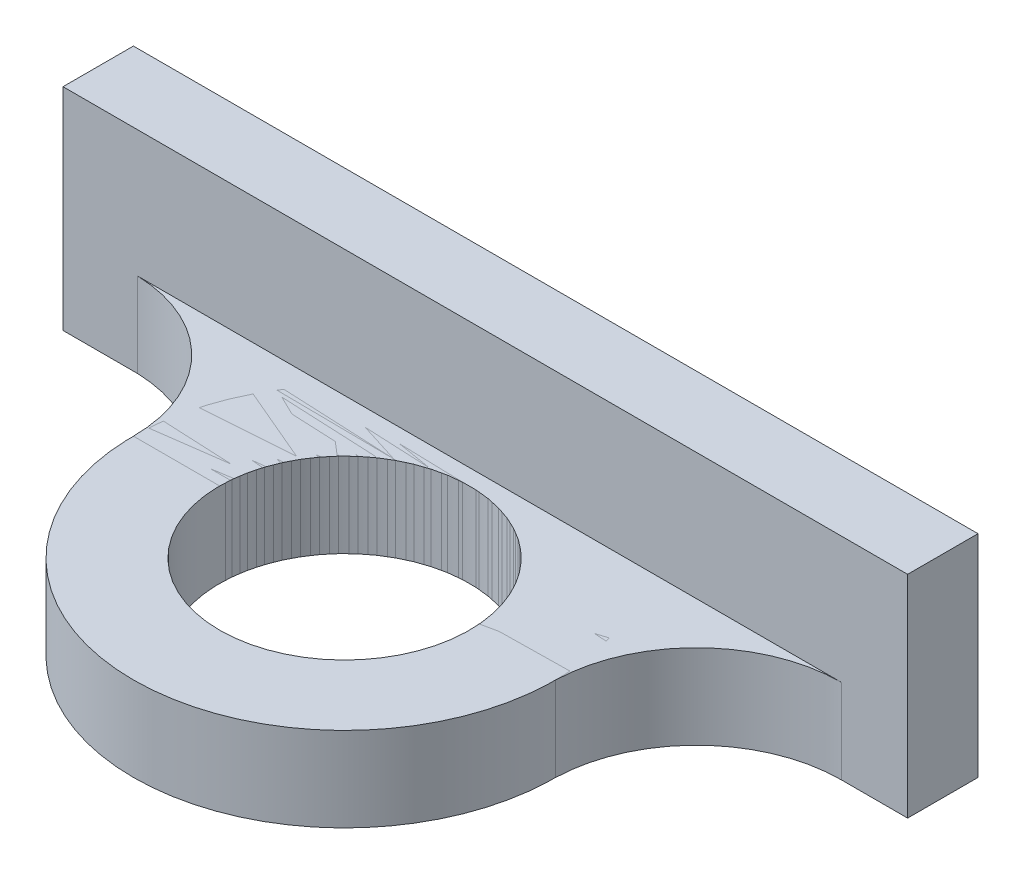
ISO-10303-21;
HEADER;
FILE_DESCRIPTION(('STEP AP214'),'2;1');
FILE_NAME('part.step','',(''),(''),'','','');
FILE_SCHEMA(('AUTOMOTIVE_DESIGN { 1 0 10303 214 1 1 1 1 }'));
ENDSEC;
DATA;
#1=APPLICATION_CONTEXT('core data for automotive mechanical design processes');
#2=APPLICATION_PROTOCOL_DEFINITION('international standard','automotive_design',2000,#1);
#3=PRODUCT_CONTEXT('',#1,'mechanical');
#4=PRODUCT('Part','Part','',(#3));
#5=PRODUCT_RELATED_PRODUCT_CATEGORY('part','',(#4));
#6=PRODUCT_DEFINITION_FORMATION('','',#4);
#7=PRODUCT_DEFINITION_CONTEXT('part definition',#1,'design');
#8=PRODUCT_DEFINITION('design','',#6,#7);
#9=PRODUCT_DEFINITION_SHAPE('','',#8);
#10=(LENGTH_UNIT() NAMED_UNIT(*) SI_UNIT(.MILLI.,.METRE.));
#11=(NAMED_UNIT(*) PLANE_ANGLE_UNIT() SI_UNIT($,.RADIAN.));
#12=(NAMED_UNIT(*) SI_UNIT($,.STERADIAN.) SOLID_ANGLE_UNIT());
#13=UNCERTAINTY_MEASURE_WITH_UNIT(LENGTH_MEASURE(1.E-05),#10,'distance_accuracy_value','');
#14=(GEOMETRIC_REPRESENTATION_CONTEXT(3) GLOBAL_UNCERTAINTY_ASSIGNED_CONTEXT((#13)) GLOBAL_UNIT_ASSIGNED_CONTEXT((#10,
#11,#12)) REPRESENTATION_CONTEXT('',''));
#15=CARTESIAN_POINT('',(0.,0.,0.));
#16=DIRECTION('',(0.,0.,1.));
#17=DIRECTION('',(1.,0.,0.));
#18=AXIS2_PLACEMENT_3D('',#15,#16,#17);
#19=CARTESIAN_POINT('',(0.,12.,-20.));
#20=DIRECTION('',(0.,0.,-1.));
#21=DIRECTION('',(-1.,0.,0.));
#22=AXIS2_PLACEMENT_3D('',#19,#20,#21);
#23=PLANE('',#22);
#24=DIRECTION('',(1.,0.,0.));
#25=VECTOR('',#24,1.);
#26=CARTESIAN_POINT('',(0.,0.,-20.));
#27=LINE('',#26,#25);
#28=CARTESIAN_POINT('',(-49.4267459225819,0.,-20.));
#29=VERTEX_POINT('',#28);
#30=CARTESIAN_POINT('',(50.5901699437495,0.,-20.));
#31=VERTEX_POINT('',#30);
#32=EDGE_CURVE('E132',#29,#31,#27,.T.);
#33=ORIENTED_EDGE('',*,*,#32,.F.);
#34=DIRECTION('',(0.,-1.,0.));
#35=VECTOR('',#34,1.);
#36=CARTESIAN_POINT('',(-49.4267459225819,12.,-20.));
#37=LINE('',#36,#35);
#38=CARTESIAN_POINT('',(-49.4267459225819,12.,-20.));
#39=VERTEX_POINT('',#38);
#40=EDGE_CURVE('E12',#39,#29,#37,.T.);
#41=ORIENTED_EDGE('',*,*,#40,.F.);
#42=DIRECTION('',(1.,0.,0.));
#43=VECTOR('',#42,1.);
#44=CARTESIAN_POINT('',(0.,12.,-20.));
#45=LINE('',#44,#43);
#46=CARTESIAN_POINT('',(50.5901699437495,12.,-20.));
#47=VERTEX_POINT('',#46);
#48=EDGE_CURVE('E146',#39,#47,#45,.T.);
#49=ORIENTED_EDGE('',*,*,#48,.T.);
#50=DIRECTION('',(0.,-1.,0.));
#51=VECTOR('',#50,1.);
#52=CARTESIAN_POINT('',(50.5901699437495,12.,-20.));
#53=LINE('',#52,#51);
#54=EDGE_CURVE('E50',#47,#31,#53,.T.);
#55=ORIENTED_EDGE('',*,*,#54,.T.);
#56=EDGE_LOOP('',(#33,#41,#49,#55));
#57=FACE_BOUND('',#56,.T.);
#58=ADVANCED_FACE('F47',(#57),#23,.T.);
#59=CARTESIAN_POINT('',(-50.0084579331656,12.,0.));
#60=DIRECTION('',(0.,-1.,0.));
#61=DIRECTION('',(0.,0.,-1.));
#62=AXIS2_PLACEMENT_3D('',#59,#60,#61);
#63=CYLINDRICAL_SURFACE('',#62,20.0084579331656);
#64=CARTESIAN_POINT('',(-50.0084579331656,0.,0.));
#65=DIRECTION('',(0.,-1.,0.));
#66=DIRECTION('',(0.,0.,-1.));
#67=AXIS2_PLACEMENT_3D('',#64,#65,#66);
#68=CIRCLE('',#67,20.0084579331656);
#69=CARTESIAN_POINT('',(-30.,0.,0.));
#70=VERTEX_POINT('',#69);
#71=EDGE_CURVE('E144',#70,#29,#68,.F.);
#72=ORIENTED_EDGE('',*,*,#71,.F.);
#73=DIRECTION('',(0.,-1.,0.));
#74=VECTOR('',#73,1.);
#75=CARTESIAN_POINT('',(-30.,12.,0.));
#76=LINE('',#75,#74);
#77=CARTESIAN_POINT('',(-30.,12.,0.));
#78=VERTEX_POINT('',#77);
#79=EDGE_CURVE('E56',#78,#70,#76,.T.);
#80=ORIENTED_EDGE('',*,*,#79,.F.);
#81=CARTESIAN_POINT('',(-50.0084579331656,12.,0.));
#82=DIRECTION('',(0.,-1.,0.));
#83=DIRECTION('',(0.,0.,-1.));
#84=AXIS2_PLACEMENT_3D('',#81,#82,#83);
#85=CIRCLE('',#84,20.0084579331656);
#86=EDGE_CURVE('E114',#78,#39,#85,.F.);
#87=ORIENTED_EDGE('',*,*,#86,.T.);
#88=ORIENTED_EDGE('',*,*,#40,.T.);
#89=EDGE_LOOP('',(#72,#80,#87,#88));
#90=FACE_BOUND('',#89,.T.);
#91=ADVANCED_FACE('F154',(#90),#63,.F.);
#92=CARTESIAN_POINT('',(0.,12.,0.));
#93=DIRECTION('',(0.,0.,-1.));
#94=DIRECTION('',(-1.,0.,0.));
#95=AXIS2_PLACEMENT_3D('',#92,#93,#94);
#96=PLANE('',#95);
#97=DIRECTION('',(1.,0.,0.));
#98=VECTOR('',#97,1.);
#99=CARTESIAN_POINT('',(0.,0.,0.));
#100=LINE('',#99,#98);
#101=CARTESIAN_POINT('',(-17.75,0.,0.));
#102=VERTEX_POINT('',#101);
#103=EDGE_CURVE('E118',#70,#102,#100,.T.);
#104=ORIENTED_EDGE('',*,*,#103,.T.);
#105=DIRECTION('',(0.,-1.,0.));
#106=VECTOR('',#105,1.);
#107=CARTESIAN_POINT('',(-17.75,12.,0.));
#108=LINE('',#107,#106);
#109=CARTESIAN_POINT('',(-17.75,12.,0.));
#110=VERTEX_POINT('',#109);
#111=EDGE_CURVE('E116',#110,#102,#108,.T.);
#112=ORIENTED_EDGE('',*,*,#111,.F.);
#113=DIRECTION('',(1.,0.,0.));
#114=VECTOR('',#113,1.);
#115=CARTESIAN_POINT('',(0.,12.,0.));
#116=LINE('',#115,#114);
#117=EDGE_CURVE('E107',#78,#110,#116,.T.);
#118=ORIENTED_EDGE('',*,*,#117,.F.);
#119=ORIENTED_EDGE('',*,*,#79,.T.);
#120=EDGE_LOOP('',(#104,#112,#118,#119));
#121=FACE_BOUND('',#120,.T.);
#122=ADVANCED_FACE('F117',(#121),#96,.F.);
#123=CARTESIAN_POINT('',(0.,12.,0.));
#124=DIRECTION('',(0.,-1.,0.));
#125=DIRECTION('',(0.,0.,-1.));
#126=AXIS2_PLACEMENT_3D('',#123,#124,#125);
#127=CYLINDRICAL_SURFACE('',#126,17.75);
#128=CARTESIAN_POINT('',(0.,0.,0.));
#129=DIRECTION('',(0.,-1.,0.));
#130=DIRECTION('',(0.,0.,-1.));
#131=AXIS2_PLACEMENT_3D('',#128,#129,#130);
#132=CIRCLE('',#131,17.75);
#133=CARTESIAN_POINT('',(17.75,0.,0.));
#134=VERTEX_POINT('',#133);
#135=EDGE_CURVE('E141',#134,#102,#132,.F.);
#136=ORIENTED_EDGE('',*,*,#135,.F.);
#137=DIRECTION('',(0.,-1.,0.));
#138=VECTOR('',#137,1.);
#139=CARTESIAN_POINT('',(17.75,12.,0.));
#140=LINE('',#139,#138);
#141=CARTESIAN_POINT('',(17.75,12.,0.));
#142=VERTEX_POINT('',#141);
#143=EDGE_CURVE('E122',#142,#134,#140,.T.);
#144=ORIENTED_EDGE('',*,*,#143,.F.);
#145=CARTESIAN_POINT('',(0.,12.,0.));
#146=DIRECTION('',(0.,-1.,0.));
#147=DIRECTION('',(0.,0.,-1.));
#148=AXIS2_PLACEMENT_3D('',#145,#146,#147);
#149=CIRCLE('',#148,17.75);
#150=EDGE_CURVE('E112',#142,#110,#149,.F.);
#151=ORIENTED_EDGE('',*,*,#150,.T.);
#152=ORIENTED_EDGE('',*,*,#111,.T.);
#153=EDGE_LOOP('',(#136,#144,#151,#152));
#154=FACE_BOUND('',#153,.T.);
#155=ADVANCED_FACE('F124',(#154),#127,.F.);
#156=CARTESIAN_POINT('',(0.,12.,0.));
#157=DIRECTION('',(0.,0.,1.));
#158=DIRECTION('',(1.,0.,0.));
#159=AXIS2_PLACEMENT_3D('',#156,#157,#158);
#160=PLANE('',#159);
#161=DIRECTION('',(-1.,0.,0.));
#162=VECTOR('',#161,1.);
#163=CARTESIAN_POINT('',(0.,0.,0.));
#164=LINE('',#163,#162);
#165=CARTESIAN_POINT('',(30.,0.,0.));
#166=VERTEX_POINT('',#165);
#167=EDGE_CURVE('E138',#166,#134,#164,.T.);
#168=ORIENTED_EDGE('',*,*,#167,.F.);
#169=DIRECTION('',(0.,-1.,0.));
#170=VECTOR('',#169,1.);
#171=CARTESIAN_POINT('',(30.,12.,0.));
#172=LINE('',#171,#170);
#173=CARTESIAN_POINT('',(30.,12.,0.));
#174=VERTEX_POINT('',#173);
#175=EDGE_CURVE('E149',#174,#166,#172,.T.);
#176=ORIENTED_EDGE('',*,*,#175,.F.);
#177=DIRECTION('',(-1.,0.,0.));
#178=VECTOR('',#177,1.);
#179=CARTESIAN_POINT('',(0.,12.,0.));
#180=LINE('',#179,#178);
#181=EDGE_CURVE('E125',#174,#142,#180,.T.);
#182=ORIENTED_EDGE('',*,*,#181,.T.);
#183=ORIENTED_EDGE('',*,*,#143,.T.);
#184=EDGE_LOOP('',(#168,#176,#182,#183));
#185=FACE_BOUND('',#184,.T.);
#186=ADVANCED_FACE('F167',(#185),#160,.T.);
#187=CARTESIAN_POINT('',(50.5901699437495,12.,0.598877457812107));
#188=DIRECTION('',(0.,-1.,0.));
#189=DIRECTION('',(0.,0.,-1.));
#190=AXIS2_PLACEMENT_3D('',#187,#188,#189);
#191=CYLINDRICAL_SURFACE('',#190,20.5988774578121);
#192=CARTESIAN_POINT('',(50.5901699437495,0.,0.598877457812107));
#193=DIRECTION('',(0.,-1.,0.));
#194=DIRECTION('',(0.,0.,-1.));
#195=AXIS2_PLACEMENT_3D('',#192,#193,#194);
#196=CIRCLE('',#195,20.5988774578121);
#197=EDGE_CURVE('E135',#31,#166,#196,.F.);
#198=ORIENTED_EDGE('',*,*,#197,.F.);
#199=ORIENTED_EDGE('',*,*,#54,.F.);
#200=CARTESIAN_POINT('',(50.5901699437495,12.,0.598877457812107));
#201=DIRECTION('',(0.,-1.,0.));
#202=DIRECTION('',(0.,0.,-1.));
#203=AXIS2_PLACEMENT_3D('',#200,#201,#202);
#204=CIRCLE('',#203,20.5988774578121);
#205=EDGE_CURVE('E127',#47,#174,#204,.F.);
#206=ORIENTED_EDGE('',*,*,#205,.T.);
#207=ORIENTED_EDGE('',*,*,#175,.T.);
#208=EDGE_LOOP('',(#198,#199,#206,#207));
#209=FACE_BOUND('',#208,.T.);
#210=ADVANCED_FACE('F151',(#209),#191,.F.);
#211=CARTESIAN_POINT('',(0.,12.,0.));
#212=DIRECTION('',(0.,-1.,0.));
#213=DIRECTION('',(0.,0.,-1.));
#214=AXIS2_PLACEMENT_3D('',#211,#212,#213);
#215=PLANE('',#214);
#216=ORIENTED_EDGE('',*,*,#48,.F.);
#217=ORIENTED_EDGE('',*,*,#86,.F.);
#218=ORIENTED_EDGE('',*,*,#117,.T.);
#219=ORIENTED_EDGE('',*,*,#150,.F.);
#220=ORIENTED_EDGE('',*,*,#181,.F.);
#221=ORIENTED_EDGE('',*,*,#205,.F.);
#222=EDGE_LOOP('',(#216,#217,#218,#219,#220,#221));
#223=FACE_BOUND('',#222,.T.);
#224=ADVANCED_FACE('F109',(#223),#215,.F.);
#225=CARTESIAN_POINT('',(0.,0.,0.));
#226=DIRECTION('',(0.,-1.,0.));
#227=DIRECTION('',(0.,0.,-1.));
#228=AXIS2_PLACEMENT_3D('',#225,#226,#227);
#229=PLANE('',#228);
#230=ORIENTED_EDGE('',*,*,#32,.T.);
#231=ORIENTED_EDGE('',*,*,#197,.T.);
#232=ORIENTED_EDGE('',*,*,#167,.T.);
#233=ORIENTED_EDGE('',*,*,#135,.T.);
#234=ORIENTED_EDGE('',*,*,#103,.F.);
#235=ORIENTED_EDGE('',*,*,#71,.T.);
#236=EDGE_LOOP('',(#230,#231,#232,#233,#234,#235));
#237=FACE_BOUND('',#236,.T.);
#238=ADVANCED_FACE('F153',(#237),#229,.T.);
#239=CLOSED_SHELL('',(#58,#91,#122,#155,#186,#210,#224,#238));
#240=MANIFOLD_SOLID_BREP('B2',#239);
#241=CARTESIAN_POINT('',(0.,12.,0.));
#242=DIRECTION('',(0.,1.,0.));
#243=DIRECTION('',(0.,0.,1.));
#244=AXIS2_PLACEMENT_3D('',#241,#242,#243);
#245=PLANE('',#244);
#246=DIRECTION('',(1.,0.,0.));
#247=VECTOR('',#246,1.);
#248=CARTESIAN_POINT('',(0.,12.,-20.));
#249=LINE('',#248,#247);
#250=CARTESIAN_POINT('',(-22.3606797749979,12.,-20.));
#251=VERTEX_POINT('',#250);
#252=CARTESIAN_POINT('',(22.3606797749979,12.,-20.));
#253=VERTEX_POINT('',#252);
#254=EDGE_CURVE('E265',#251,#253,#249,.T.);
#255=ORIENTED_EDGE('',*,*,#254,.F.);
#256=CARTESIAN_POINT('',(0.,12.,0.));
#257=DIRECTION('',(0.,1.,0.));
#258=DIRECTION('',(0.,0.,1.));
#259=AXIS2_PLACEMENT_3D('',#256,#257,#258);
#260=CIRCLE('',#259,30.);
#261=EDGE_CURVE('E348',#251,#253,#260,.T.);
#262=ORIENTED_EDGE('',*,*,#261,.T.);
#263=EDGE_LOOP('',(#255,#262));
#264=FACE_BOUND('',#263,.T.);
#265=CARTESIAN_POINT('',(0.,12.,0.));
#266=DIRECTION('',(0.,1.,0.));
#267=DIRECTION('',(0.,0.,1.));
#268=AXIS2_PLACEMENT_3D('',#265,#266,#267);
#269=CIRCLE('',#268,17.75);
#270=CARTESIAN_POINT('',(0.,12.,17.75));
#271=VERTEX_POINT('',#270);
#272=EDGE_CURVE('E343',#271,#271,#269,.T.);
#273=ORIENTED_EDGE('',*,*,#272,.F.);
#274=EDGE_LOOP('',(#273));
#275=FACE_BOUND('',#274,.T.);
#276=ADVANCED_FACE('F244',(#264,#275),#245,.T.);
#277=CARTESIAN_POINT('',(0.,0.,0.));
#278=DIRECTION('',(0.,1.,0.));
#279=DIRECTION('',(0.,0.,1.));
#280=AXIS2_PLACEMENT_3D('',#277,#278,#279);
#281=PLANE('',#280);
#282=CARTESIAN_POINT('',(0.,0.,0.));
#283=DIRECTION('',(0.,1.,0.));
#284=DIRECTION('',(0.,0.,1.));
#285=AXIS2_PLACEMENT_3D('',#282,#283,#284);
#286=CIRCLE('',#285,30.);
#287=CARTESIAN_POINT('',(-22.3606797749979,0.,-20.));
#288=VERTEX_POINT('',#287);
#289=CARTESIAN_POINT('',(22.3606797749979,0.,-20.));
#290=VERTEX_POINT('',#289);
#291=EDGE_CURVE('E258',#288,#290,#286,.T.);
#292=ORIENTED_EDGE('',*,*,#291,.F.);
#293=DIRECTION('',(-1.,0.,0.));
#294=VECTOR('',#293,1.);
#295=CARTESIAN_POINT('',(0.,0.,-20.));
#296=LINE('',#295,#294);
#297=CARTESIAN_POINT('',(-60.,0.,-20.));
#298=VERTEX_POINT('',#297);
#299=EDGE_CURVE('E330',#288,#298,#296,.T.);
#300=ORIENTED_EDGE('',*,*,#299,.T.);
#301=DIRECTION('',(0.,0.,-1.));
#302=VECTOR('',#301,1.);
#303=CARTESIAN_POINT('',(-60.,0.,-30.));
#304=LINE('',#303,#302);
#305=CARTESIAN_POINT('',(-60.,0.,-30.));
#306=VERTEX_POINT('',#305);
#307=EDGE_CURVE('E309',#298,#306,#304,.T.);
#308=ORIENTED_EDGE('',*,*,#307,.T.);
#309=DIRECTION('',(1.,0.,0.));
#310=VECTOR('',#309,1.);
#311=CARTESIAN_POINT('',(0.,0.,-30.));
#312=LINE('',#311,#310);
#313=CARTESIAN_POINT('',(60.,0.,-30.));
#314=VERTEX_POINT('',#313);
#315=EDGE_CURVE('E327',#306,#314,#312,.T.);
#316=ORIENTED_EDGE('',*,*,#315,.T.);
#317=DIRECTION('',(0.,0.,1.));
#318=VECTOR('',#317,1.);
#319=CARTESIAN_POINT('',(60.,0.,-30.));
#320=LINE('',#319,#318);
#321=CARTESIAN_POINT('',(60.,0.,-20.));
#322=VERTEX_POINT('',#321);
#323=EDGE_CURVE('E316',#314,#322,#320,.T.);
#324=ORIENTED_EDGE('',*,*,#323,.T.);
#325=EDGE_CURVE('E331',#322,#290,#296,.T.);
#326=ORIENTED_EDGE('',*,*,#325,.T.);
#327=EDGE_LOOP('',(#292,#300,#308,#316,#324,#326));
#328=FACE_BOUND('',#327,.T.);
#329=CARTESIAN_POINT('',(0.,0.,0.));
#330=DIRECTION('',(0.,1.,0.));
#331=DIRECTION('',(0.,0.,1.));
#332=AXIS2_PLACEMENT_3D('',#329,#330,#331);
#333=CIRCLE('',#332,17.75);
#334=CARTESIAN_POINT('',(0.,0.,17.75));
#335=VERTEX_POINT('',#334);
#336=EDGE_CURVE('E342',#335,#335,#333,.T.);
#337=ORIENTED_EDGE('',*,*,#336,.T.);
#338=EDGE_LOOP('',(#337));
#339=FACE_BOUND('',#338,.T.);
#340=ADVANCED_FACE('F358',(#328,#339),#281,.F.);
#341=CARTESIAN_POINT('',(0.,12.,0.));
#342=DIRECTION('',(0.,-1.,0.));
#343=DIRECTION('',(0.,0.,-1.));
#344=AXIS2_PLACEMENT_3D('',#341,#342,#343);
#345=CYLINDRICAL_SURFACE('',#344,30.);
#346=ORIENTED_EDGE('',*,*,#261,.F.);
#347=DIRECTION('',(0.,-1.,0.));
#348=VECTOR('',#347,1.);
#349=CARTESIAN_POINT('',(-22.3606797749979,12.,-20.));
#350=LINE('',#349,#348);
#351=EDGE_CURVE('E45',#251,#288,#350,.T.);
#352=ORIENTED_EDGE('',*,*,#351,.T.);
#353=ORIENTED_EDGE('',*,*,#291,.T.);
#354=DIRECTION('',(0.,-1.,0.));
#355=VECTOR('',#354,1.);
#356=CARTESIAN_POINT('',(22.3606797749979,12.,-20.));
#357=LINE('',#356,#355);
#358=EDGE_CURVE('E252',#290,#253,#357,.F.);
#359=ORIENTED_EDGE('',*,*,#358,.T.);
#360=EDGE_LOOP('',(#346,#352,#353,#359));
#361=FACE_BOUND('',#360,.T.);
#362=ADVANCED_FACE('F246',(#361),#345,.T.);
#363=CARTESIAN_POINT('',(0.,12.,0.));
#364=DIRECTION('',(0.,-1.,0.));
#365=DIRECTION('',(0.,0.,-1.));
#366=AXIS2_PLACEMENT_3D('',#363,#364,#365);
#367=CYLINDRICAL_SURFACE('',#366,17.75);
#368=ORIENTED_EDGE('',*,*,#272,.T.);
#369=EDGE_LOOP('',(#368));
#370=FACE_BOUND('',#369,.T.);
#371=ORIENTED_EDGE('',*,*,#336,.F.);
#372=EDGE_LOOP('',(#371));
#373=FACE_BOUND('',#372,.T.);
#374=ADVANCED_FACE('F369',(#370,#373),#367,.F.);
#375=CARTESIAN_POINT('',(0.,30.,-20.));
#376=DIRECTION('',(0.,0.,1.));
#377=DIRECTION('',(1.,0.,0.));
#378=AXIS2_PLACEMENT_3D('',#375,#376,#377);
#379=PLANE('',#378);
#380=ORIENTED_EDGE('',*,*,#351,.F.);
#381=ORIENTED_EDGE('',*,*,#254,.T.);
#382=ORIENTED_EDGE('',*,*,#358,.F.);
#383=ORIENTED_EDGE('',*,*,#325,.F.);
#384=DIRECTION('',(0.,-1.,0.));
#385=VECTOR('',#384,1.);
#386=CARTESIAN_POINT('',(60.,30.,-20.));
#387=LINE('',#386,#385);
#388=CARTESIAN_POINT('',(60.,30.,-20.));
#389=VERTEX_POINT('',#388);
#390=EDGE_CURVE('E317',#389,#322,#387,.T.);
#391=ORIENTED_EDGE('',*,*,#390,.F.);
#392=DIRECTION('',(-1.,0.,0.));
#393=VECTOR('',#392,1.);
#394=CARTESIAN_POINT('',(60.,30.,-20.));
#395=LINE('',#394,#393);
#396=CARTESIAN_POINT('',(-60.,30.,-20.));
#397=VERTEX_POINT('',#396);
#398=EDGE_CURVE('E322',#389,#397,#395,.T.);
#399=ORIENTED_EDGE('',*,*,#398,.T.);
#400=DIRECTION('',(0.,-1.,0.));
#401=VECTOR('',#400,1.);
#402=CARTESIAN_POINT('',(-60.,30.,-20.));
#403=LINE('',#402,#401);
#404=EDGE_CURVE('E337',#397,#298,#403,.T.);
#405=ORIENTED_EDGE('',*,*,#404,.T.);
#406=ORIENTED_EDGE('',*,*,#299,.F.);
#407=EDGE_LOOP('',(#380,#381,#382,#383,#391,#399,#405,#406));
#408=FACE_BOUND('',#407,.T.);
#409=ADVANCED_FACE('F353',(#408),#379,.T.);
#410=CARTESIAN_POINT('',(-60.,30.,-30.));
#411=DIRECTION('',(-1.,0.,0.));
#412=DIRECTION('',(0.,0.,1.));
#413=AXIS2_PLACEMENT_3D('',#410,#411,#412);
#414=PLANE('',#413);
#415=ORIENTED_EDGE('',*,*,#307,.F.);
#416=ORIENTED_EDGE('',*,*,#404,.F.);
#417=DIRECTION('',(0.,0.,-1.));
#418=VECTOR('',#417,1.);
#419=CARTESIAN_POINT('',(-60.,30.,-30.));
#420=LINE('',#419,#418);
#421=CARTESIAN_POINT('',(-60.,30.,-30.));
#422=VERTEX_POINT('',#421);
#423=EDGE_CURVE('E318',#397,#422,#420,.T.);
#424=ORIENTED_EDGE('',*,*,#423,.T.);
#425=DIRECTION('',(0.,-1.,0.));
#426=VECTOR('',#425,1.);
#427=CARTESIAN_POINT('',(-60.,30.,-30.));
#428=LINE('',#427,#426);
#429=EDGE_CURVE('E303',#422,#306,#428,.T.);
#430=ORIENTED_EDGE('',*,*,#429,.T.);
#431=EDGE_LOOP('',(#415,#416,#424,#430));
#432=FACE_BOUND('',#431,.T.);
#433=ADVANCED_FACE('F361',(#432),#414,.T.);
#434=CARTESIAN_POINT('',(60.,30.,-30.));
#435=DIRECTION('',(1.,0.,0.));
#436=DIRECTION('',(0.,0.,-1.));
#437=AXIS2_PLACEMENT_3D('',#434,#435,#436);
#438=PLANE('',#437);
#439=ORIENTED_EDGE('',*,*,#323,.F.);
#440=DIRECTION('',(0.,-1.,0.));
#441=VECTOR('',#440,1.);
#442=CARTESIAN_POINT('',(60.,30.,-30.));
#443=LINE('',#442,#441);
#444=CARTESIAN_POINT('',(60.,30.,-30.));
#445=VERTEX_POINT('',#444);
#446=EDGE_CURVE('E300',#445,#314,#443,.T.);
#447=ORIENTED_EDGE('',*,*,#446,.F.);
#448=DIRECTION('',(0.,0.,1.));
#449=VECTOR('',#448,1.);
#450=CARTESIAN_POINT('',(60.,30.,-30.));
#451=LINE('',#450,#449);
#452=EDGE_CURVE('E308',#445,#389,#451,.T.);
#453=ORIENTED_EDGE('',*,*,#452,.T.);
#454=ORIENTED_EDGE('',*,*,#390,.T.);
#455=EDGE_LOOP('',(#439,#447,#453,#454));
#456=FACE_BOUND('',#455,.T.);
#457=ADVANCED_FACE('F313',(#456),#438,.T.);
#458=CARTESIAN_POINT('',(0.,30.,-30.));
#459=DIRECTION('',(0.,0.,-1.));
#460=DIRECTION('',(-1.,0.,0.));
#461=AXIS2_PLACEMENT_3D('',#458,#459,#460);
#462=PLANE('',#461);
#463=ORIENTED_EDGE('',*,*,#315,.F.);
#464=ORIENTED_EDGE('',*,*,#429,.F.);
#465=DIRECTION('',(1.,0.,0.));
#466=VECTOR('',#465,1.);
#467=CARTESIAN_POINT('',(0.,30.,-30.));
#468=LINE('',#467,#466);
#469=EDGE_CURVE('E297',#422,#445,#468,.T.);
#470=ORIENTED_EDGE('',*,*,#469,.T.);
#471=ORIENTED_EDGE('',*,*,#446,.T.);
#472=EDGE_LOOP('',(#463,#464,#470,#471));
#473=FACE_BOUND('',#472,.T.);
#474=ADVANCED_FACE('F299',(#473),#462,.T.);
#475=CARTESIAN_POINT('',(0.,30.,0.));
#476=DIRECTION('',(0.,1.,0.));
#477=DIRECTION('',(0.,0.,1.));
#478=AXIS2_PLACEMENT_3D('',#475,#476,#477);
#479=PLANE('',#478);
#480=ORIENTED_EDGE('',*,*,#469,.F.);
#481=ORIENTED_EDGE('',*,*,#423,.F.);
#482=ORIENTED_EDGE('',*,*,#398,.F.);
#483=ORIENTED_EDGE('',*,*,#452,.F.);
#484=EDGE_LOOP('',(#480,#481,#482,#483));
#485=FACE_BOUND('',#484,.T.);
#486=ADVANCED_FACE('F321',(#485),#479,.T.);
#487=CLOSED_SHELL('',(#276,#340,#362,#374,#409,#433,#457,#474,#486));
#488=MANIFOLD_SOLID_BREP('B6',#487);
#489=ADVANCED_BREP_SHAPE_REPRESENTATION('',(#18,#240,#488),#14);
#490=SHAPE_DEFINITION_REPRESENTATION(#9,#489);
ENDSEC;
END-ISO-10303-21;
